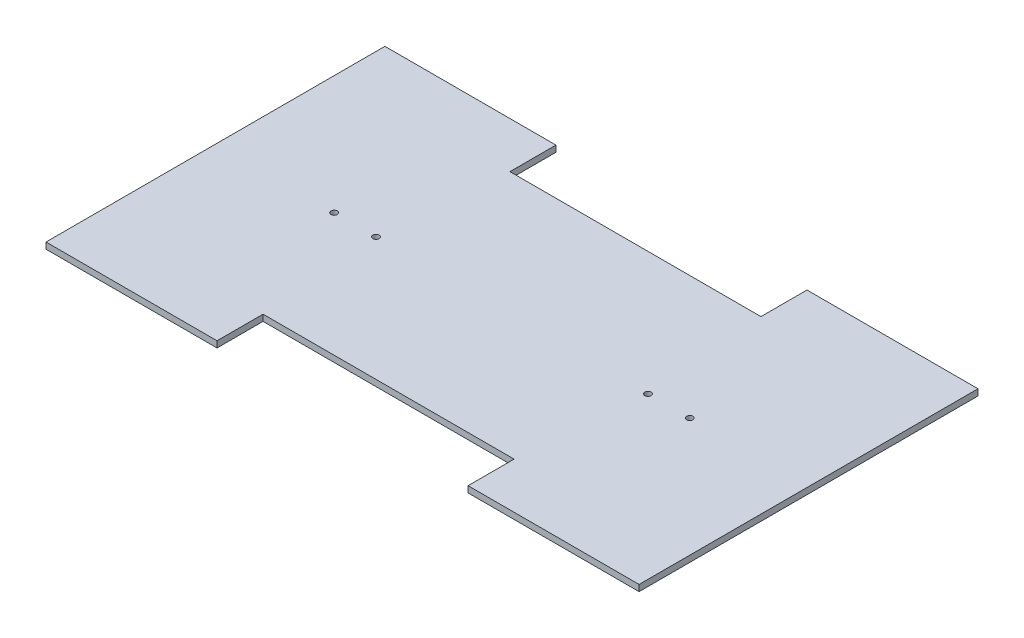
ISO-10303-21;
HEADER;
FILE_DESCRIPTION(('STEP AP214'),'2;1');
FILE_NAME('part.step','',(''),(''),'','','');
FILE_SCHEMA(('AUTOMOTIVE_DESIGN { 1 0 10303 214 1 1 1 1 }'));
ENDSEC;
DATA;
#1=APPLICATION_CONTEXT('core data for automotive mechanical design processes');
#2=APPLICATION_PROTOCOL_DEFINITION('international standard','automotive_design',2000,#1);
#3=PRODUCT_CONTEXT('',#1,'mechanical');
#4=PRODUCT('Part','Part','',(#3));
#5=PRODUCT_RELATED_PRODUCT_CATEGORY('part','',(#4));
#6=PRODUCT_DEFINITION_FORMATION('','',#4);
#7=PRODUCT_DEFINITION_CONTEXT('part definition',#1,'design');
#8=PRODUCT_DEFINITION('design','',#6,#7);
#9=PRODUCT_DEFINITION_SHAPE('','',#8);
#10=(LENGTH_UNIT() NAMED_UNIT(*) SI_UNIT(.MILLI.,.METRE.));
#11=(NAMED_UNIT(*) PLANE_ANGLE_UNIT() SI_UNIT($,.RADIAN.));
#12=(NAMED_UNIT(*) SI_UNIT($,.STERADIAN.) SOLID_ANGLE_UNIT());
#13=UNCERTAINTY_MEASURE_WITH_UNIT(LENGTH_MEASURE(1.E-05),#10,'distance_accuracy_value','');
#14=(GEOMETRIC_REPRESENTATION_CONTEXT(3) GLOBAL_UNCERTAINTY_ASSIGNED_CONTEXT((#13)) GLOBAL_UNIT_ASSIGNED_CONTEXT((#10,
#11,#12)) REPRESENTATION_CONTEXT('',''));
#15=CARTESIAN_POINT('',(0.,0.,0.));
#16=DIRECTION('',(0.,0.,1.));
#17=DIRECTION('',(1.,0.,0.));
#18=AXIS2_PLACEMENT_3D('',#15,#16,#17);
#19=CARTESIAN_POINT('',(-141.75,3.,-81.));
#20=DIRECTION('',(0.,0.,1.));
#21=DIRECTION('',(1.,0.,0.));
#22=AXIS2_PLACEMENT_3D('',#19,#20,#21);
#23=PLANE('',#22);
#24=DIRECTION('',(-1.,0.,0.));
#25=VECTOR('',#24,1.);
#26=CARTESIAN_POINT('',(-141.75,3.,-81.));
#27=LINE('',#26,#25);
#28=CARTESIAN_POINT('',(-60.,3.,-81.));
#29=VERTEX_POINT('',#28);
#30=CARTESIAN_POINT('',(-141.75,3.,-81.));
#31=VERTEX_POINT('',#30);
#32=EDGE_CURVE('E224',#29,#31,#27,.T.);
#33=ORIENTED_EDGE('',*,*,#32,.F.);
#34=DIRECTION('',(0.,1.,0.));
#35=VECTOR('',#34,1.);
#36=CARTESIAN_POINT('',(-60.,0.,-81.));
#37=LINE('',#36,#35);
#38=CARTESIAN_POINT('',(-60.,0.,-81.));
#39=VERTEX_POINT('',#38);
#40=EDGE_CURVE('E164',#39,#29,#37,.T.);
#41=ORIENTED_EDGE('',*,*,#40,.F.);
#42=DIRECTION('',(-1.,0.,0.));
#43=VECTOR('',#42,1.);
#44=CARTESIAN_POINT('',(-141.75,0.,-81.));
#45=LINE('',#44,#43);
#46=CARTESIAN_POINT('',(-141.75,0.,-81.));
#47=VERTEX_POINT('',#46);
#48=EDGE_CURVE('E281',#39,#47,#45,.T.);
#49=ORIENTED_EDGE('',*,*,#48,.T.);
#50=DIRECTION('',(0.,-1.,0.));
#51=VECTOR('',#50,1.);
#52=CARTESIAN_POINT('',(-141.75,3.,-81.));
#53=LINE('',#52,#51);
#54=EDGE_CURVE('E49',#31,#47,#53,.T.);
#55=ORIENTED_EDGE('',*,*,#54,.F.);
#56=EDGE_LOOP('',(#33,#41,#49,#55));
#57=FACE_BOUND('',#56,.T.);
#58=ADVANCED_FACE('F41',(#57),#23,.F.);
#59=CARTESIAN_POINT('',(-141.75,3.,81.));
#60=DIRECTION('',(0.,0.,-1.));
#61=DIRECTION('',(-1.,0.,0.));
#62=AXIS2_PLACEMENT_3D('',#59,#60,#61);
#63=PLANE('',#62);
#64=DIRECTION('',(1.,0.,0.));
#65=VECTOR('',#64,1.);
#66=CARTESIAN_POINT('',(-141.75,3.,81.));
#67=LINE('',#66,#65);
#68=CARTESIAN_POINT('',(60.,3.,81.));
#69=VERTEX_POINT('',#68);
#70=CARTESIAN_POINT('',(141.75,3.,81.));
#71=VERTEX_POINT('',#70);
#72=EDGE_CURVE('E181',#69,#71,#67,.T.);
#73=ORIENTED_EDGE('',*,*,#72,.F.);
#74=DIRECTION('',(0.,1.,0.));
#75=VECTOR('',#74,1.);
#76=CARTESIAN_POINT('',(60.,0.,81.));
#77=LINE('',#76,#75);
#78=CARTESIAN_POINT('',(60.,0.,81.));
#79=VERTEX_POINT('',#78);
#80=EDGE_CURVE('E193',#79,#69,#77,.T.);
#81=ORIENTED_EDGE('',*,*,#80,.F.);
#82=DIRECTION('',(1.,0.,0.));
#83=VECTOR('',#82,1.);
#84=CARTESIAN_POINT('',(-141.75,0.,81.));
#85=LINE('',#84,#83);
#86=CARTESIAN_POINT('',(141.75,0.,81.));
#87=VERTEX_POINT('',#86);
#88=EDGE_CURVE('E150',#79,#87,#85,.T.);
#89=ORIENTED_EDGE('',*,*,#88,.T.);
#90=DIRECTION('',(0.,-1.,0.));
#91=VECTOR('',#90,1.);
#92=CARTESIAN_POINT('',(141.75,3.,81.));
#93=LINE('',#92,#91);
#94=EDGE_CURVE('E180',#71,#87,#93,.T.);
#95=ORIENTED_EDGE('',*,*,#94,.F.);
#96=EDGE_LOOP('',(#73,#81,#89,#95));
#97=FACE_BOUND('',#96,.T.);
#98=ADVANCED_FACE('F294',(#97),#63,.F.);
#99=CARTESIAN_POINT('',(141.75,3.,-81.));
#100=DIRECTION('',(-1.,0.,0.));
#101=DIRECTION('',(0.,0.,1.));
#102=AXIS2_PLACEMENT_3D('',#99,#100,#101);
#103=PLANE('',#102);
#104=DIRECTION('',(0.,0.,-1.));
#105=VECTOR('',#104,1.);
#106=CARTESIAN_POINT('',(141.75,0.,-81.));
#107=LINE('',#106,#105);
#108=CARTESIAN_POINT('',(141.75,0.,-81.));
#109=VERTEX_POINT('',#108);
#110=EDGE_CURVE('E185',#87,#109,#107,.T.);
#111=ORIENTED_EDGE('',*,*,#110,.T.);
#112=DIRECTION('',(0.,-1.,0.));
#113=VECTOR('',#112,1.);
#114=CARTESIAN_POINT('',(141.75,3.,-81.));
#115=LINE('',#114,#113);
#116=CARTESIAN_POINT('',(141.75,3.,-81.));
#117=VERTEX_POINT('',#116);
#118=EDGE_CURVE('E12',#117,#109,#115,.T.);
#119=ORIENTED_EDGE('',*,*,#118,.F.);
#120=DIRECTION('',(0.,0.,-1.));
#121=VECTOR('',#120,1.);
#122=CARTESIAN_POINT('',(141.75,3.,-81.));
#123=LINE('',#122,#121);
#124=EDGE_CURVE('E225',#71,#117,#123,.T.);
#125=ORIENTED_EDGE('',*,*,#124,.F.);
#126=ORIENTED_EDGE('',*,*,#94,.T.);
#127=EDGE_LOOP('',(#111,#119,#125,#126));
#128=FACE_BOUND('',#127,.T.);
#129=ADVANCED_FACE('F43',(#128),#103,.F.);
#130=CARTESIAN_POINT('',(60.,0.,-81.));
#131=VERTEX_POINT('',#130);
#132=EDGE_CURVE('E282',#109,#131,#45,.T.);
#133=ORIENTED_EDGE('',*,*,#132,.T.);
#134=DIRECTION('',(0.,1.,0.));
#135=VECTOR('',#134,1.);
#136=CARTESIAN_POINT('',(60.,0.,-81.));
#137=LINE('',#136,#135);
#138=CARTESIAN_POINT('',(60.,3.,-81.));
#139=VERTEX_POINT('',#138);
#140=EDGE_CURVE('E233',#131,#139,#137,.T.);
#141=ORIENTED_EDGE('',*,*,#140,.T.);
#142=EDGE_CURVE('E220',#117,#139,#27,.T.);
#143=ORIENTED_EDGE('',*,*,#142,.F.);
#144=ORIENTED_EDGE('',*,*,#118,.T.);
#145=EDGE_LOOP('',(#133,#141,#143,#144));
#146=FACE_BOUND('',#145,.T.);
#147=ADVANCED_FACE('F290',(#146),#23,.F.);
#148=CARTESIAN_POINT('',(-141.75,3.,-81.));
#149=DIRECTION('',(1.,0.,0.));
#150=DIRECTION('',(0.,0.,-1.));
#151=AXIS2_PLACEMENT_3D('',#148,#149,#150);
#152=PLANE('',#151);
#153=DIRECTION('',(0.,0.,1.));
#154=VECTOR('',#153,1.);
#155=CARTESIAN_POINT('',(-141.75,0.,-81.));
#156=LINE('',#155,#154);
#157=CARTESIAN_POINT('',(-141.75,0.,81.));
#158=VERTEX_POINT('',#157);
#159=EDGE_CURVE('E269',#47,#158,#156,.T.);
#160=ORIENTED_EDGE('',*,*,#159,.T.);
#161=DIRECTION('',(0.,-1.,0.));
#162=VECTOR('',#161,1.);
#163=CARTESIAN_POINT('',(-141.75,3.,81.));
#164=LINE('',#163,#162);
#165=CARTESIAN_POINT('',(-141.75,3.,81.));
#166=VERTEX_POINT('',#165);
#167=EDGE_CURVE('E264',#166,#158,#164,.T.);
#168=ORIENTED_EDGE('',*,*,#167,.F.);
#169=DIRECTION('',(0.,0.,1.));
#170=VECTOR('',#169,1.);
#171=CARTESIAN_POINT('',(-141.75,3.,-81.));
#172=LINE('',#171,#170);
#173=EDGE_CURVE('E182',#31,#166,#172,.T.);
#174=ORIENTED_EDGE('',*,*,#173,.F.);
#175=ORIENTED_EDGE('',*,*,#54,.T.);
#176=EDGE_LOOP('',(#160,#168,#174,#175));
#177=FACE_BOUND('',#176,.T.);
#178=ADVANCED_FACE('F278',(#177),#152,.F.);
#179=CARTESIAN_POINT('',(-60.,0.,81.));
#180=VERTEX_POINT('',#179);
#181=EDGE_CURVE('E262',#158,#180,#85,.T.);
#182=ORIENTED_EDGE('',*,*,#181,.T.);
#183=DIRECTION('',(0.,1.,0.));
#184=VECTOR('',#183,1.);
#185=CARTESIAN_POINT('',(-60.,0.,81.));
#186=LINE('',#185,#184);
#187=CARTESIAN_POINT('',(-60.,3.,81.));
#188=VERTEX_POINT('',#187);
#189=EDGE_CURVE('E195',#180,#188,#186,.T.);
#190=ORIENTED_EDGE('',*,*,#189,.T.);
#191=EDGE_CURVE('E174',#166,#188,#67,.T.);
#192=ORIENTED_EDGE('',*,*,#191,.F.);
#193=ORIENTED_EDGE('',*,*,#167,.T.);
#194=EDGE_LOOP('',(#182,#190,#192,#193));
#195=FACE_BOUND('',#194,.T.);
#196=ADVANCED_FACE('F259',(#195),#63,.F.);
#197=CARTESIAN_POINT('',(0.,3.,0.));
#198=DIRECTION('',(0.,1.,0.));
#199=DIRECTION('',(0.,0.,1.));
#200=AXIS2_PLACEMENT_3D('',#197,#198,#199);
#201=PLANE('',#200);
#202=CARTESIAN_POINT('',(-85.,3.,0.));
#203=DIRECTION('',(0.,1.,0.));
#204=DIRECTION('',(0.,0.,1.));
#205=AXIS2_PLACEMENT_3D('',#202,#203,#204);
#206=CIRCLE('',#205,1.5);
#207=CARTESIAN_POINT('',(-85.,3.,1.5));
#208=VERTEX_POINT('',#207);
#209=EDGE_CURVE('E447',#208,#208,#206,.T.);
#210=ORIENTED_EDGE('',*,*,#209,.F.);
#211=EDGE_LOOP('',(#210));
#212=FACE_BOUND('',#211,.T.);
#213=CARTESIAN_POINT('',(-65.,3.,0.));
#214=DIRECTION('',(0.,1.,0.));
#215=DIRECTION('',(0.,0.,1.));
#216=AXIS2_PLACEMENT_3D('',#213,#214,#215);
#217=CIRCLE('',#216,1.50000000000001);
#218=CARTESIAN_POINT('',(-65.,3.,1.50000000000002));
#219=VERTEX_POINT('',#218);
#220=EDGE_CURVE('E454',#219,#219,#217,.T.);
#221=ORIENTED_EDGE('',*,*,#220,.F.);
#222=EDGE_LOOP('',(#221));
#223=FACE_BOUND('',#222,.T.);
#224=CARTESIAN_POINT('',(65.,3.,0.));
#225=DIRECTION('',(0.,1.,0.));
#226=DIRECTION('',(0.,0.,1.));
#227=AXIS2_PLACEMENT_3D('',#224,#225,#226);
#228=CIRCLE('',#227,1.50000000000001);
#229=CARTESIAN_POINT('',(65.,3.,1.50000000000001));
#230=VERTEX_POINT('',#229);
#231=EDGE_CURVE('E466',#230,#230,#228,.T.);
#232=ORIENTED_EDGE('',*,*,#231,.F.);
#233=EDGE_LOOP('',(#232));
#234=FACE_BOUND('',#233,.T.);
#235=CARTESIAN_POINT('',(85.,3.,0.));
#236=DIRECTION('',(0.,1.,0.));
#237=DIRECTION('',(0.,0.,1.));
#238=AXIS2_PLACEMENT_3D('',#235,#236,#237);
#239=CIRCLE('',#238,1.5);
#240=CARTESIAN_POINT('',(85.,3.,1.5));
#241=VERTEX_POINT('',#240);
#242=EDGE_CURVE('E157',#241,#241,#239,.T.);
#243=ORIENTED_EDGE('',*,*,#242,.F.);
#244=EDGE_LOOP('',(#243));
#245=FACE_BOUND('',#244,.T.);
#246=DIRECTION('',(0.,0.,-1.));
#247=VECTOR('',#246,1.);
#248=CARTESIAN_POINT('',(60.,3.,81.));
#249=LINE('',#248,#247);
#250=CARTESIAN_POINT('',(60.,3.,59.));
#251=VERTEX_POINT('',#250);
#252=EDGE_CURVE('E136',#69,#251,#249,.T.);
#253=ORIENTED_EDGE('',*,*,#252,.F.);
#254=ORIENTED_EDGE('',*,*,#72,.T.);
#255=ORIENTED_EDGE('',*,*,#124,.T.);
#256=ORIENTED_EDGE('',*,*,#142,.T.);
#257=DIRECTION('',(0.,0.,-1.));
#258=VECTOR('',#257,1.);
#259=CARTESIAN_POINT('',(60.,3.,-81.));
#260=LINE('',#259,#258);
#261=CARTESIAN_POINT('',(60.,3.,-59.));
#262=VERTEX_POINT('',#261);
#263=EDGE_CURVE('E203',#262,#139,#260,.T.);
#264=ORIENTED_EDGE('',*,*,#263,.F.);
#265=DIRECTION('',(1.,0.,0.));
#266=VECTOR('',#265,1.);
#267=CARTESIAN_POINT('',(-60.,3.,-59.));
#268=LINE('',#267,#266);
#269=CARTESIAN_POINT('',(-60.,3.,-59.));
#270=VERTEX_POINT('',#269);
#271=EDGE_CURVE('E213',#270,#262,#268,.T.);
#272=ORIENTED_EDGE('',*,*,#271,.F.);
#273=DIRECTION('',(0.,0.,1.));
#274=VECTOR('',#273,1.);
#275=CARTESIAN_POINT('',(-60.,3.,-81.));
#276=LINE('',#275,#274);
#277=EDGE_CURVE('E208',#29,#270,#276,.T.);
#278=ORIENTED_EDGE('',*,*,#277,.F.);
#279=ORIENTED_EDGE('',*,*,#32,.T.);
#280=ORIENTED_EDGE('',*,*,#173,.T.);
#281=ORIENTED_EDGE('',*,*,#191,.T.);
#282=DIRECTION('',(0.,0.,1.));
#283=VECTOR('',#282,1.);
#284=CARTESIAN_POINT('',(-60.,3.,81.));
#285=LINE('',#284,#283);
#286=CARTESIAN_POINT('',(-60.,3.,59.));
#287=VERTEX_POINT('',#286);
#288=EDGE_CURVE('E151',#287,#188,#285,.T.);
#289=ORIENTED_EDGE('',*,*,#288,.F.);
#290=DIRECTION('',(-1.,0.,0.));
#291=VECTOR('',#290,1.);
#292=CARTESIAN_POINT('',(-60.,3.,59.));
#293=LINE('',#292,#291);
#294=EDGE_CURVE('E154',#251,#287,#293,.T.);
#295=ORIENTED_EDGE('',*,*,#294,.F.);
#296=EDGE_LOOP('',(#253,#254,#255,#256,#264,#272,#278,#279,#280,#281,#289,#295));
#297=FACE_BOUND('',#296,.T.);
#298=ADVANCED_FACE('F249',(#212,#223,#234,#245,#297),#201,.T.);
#299=CARTESIAN_POINT('',(0.,0.,0.));
#300=DIRECTION('',(0.,1.,0.));
#301=DIRECTION('',(0.,0.,1.));
#302=AXIS2_PLACEMENT_3D('',#299,#300,#301);
#303=PLANE('',#302);
#304=CARTESIAN_POINT('',(-85.,0.,0.));
#305=DIRECTION('',(0.,1.,0.));
#306=DIRECTION('',(0.,0.,1.));
#307=AXIS2_PLACEMENT_3D('',#304,#305,#306);
#308=CIRCLE('',#307,1.5);
#309=CARTESIAN_POINT('',(-85.,0.,1.5));
#310=VERTEX_POINT('',#309);
#311=EDGE_CURVE('E214',#310,#310,#308,.T.);
#312=ORIENTED_EDGE('',*,*,#311,.T.);
#313=EDGE_LOOP('',(#312));
#314=FACE_BOUND('',#313,.T.);
#315=CARTESIAN_POINT('',(-65.,0.,0.));
#316=DIRECTION('',(0.,1.,0.));
#317=DIRECTION('',(0.,0.,1.));
#318=AXIS2_PLACEMENT_3D('',#315,#316,#317);
#319=CIRCLE('',#318,1.50000000000001);
#320=CARTESIAN_POINT('',(-65.,0.,1.50000000000002));
#321=VERTEX_POINT('',#320);
#322=EDGE_CURVE('E449',#321,#321,#319,.T.);
#323=ORIENTED_EDGE('',*,*,#322,.T.);
#324=EDGE_LOOP('',(#323));
#325=FACE_BOUND('',#324,.T.);
#326=CARTESIAN_POINT('',(65.,0.,0.));
#327=DIRECTION('',(0.,1.,0.));
#328=DIRECTION('',(0.,0.,1.));
#329=AXIS2_PLACEMENT_3D('',#326,#327,#328);
#330=CIRCLE('',#329,1.50000000000001);
#331=CARTESIAN_POINT('',(65.,0.,1.50000000000001));
#332=VERTEX_POINT('',#331);
#333=EDGE_CURVE('E464',#332,#332,#330,.T.);
#334=ORIENTED_EDGE('',*,*,#333,.T.);
#335=EDGE_LOOP('',(#334));
#336=FACE_BOUND('',#335,.T.);
#337=CARTESIAN_POINT('',(85.,0.,0.));
#338=DIRECTION('',(0.,1.,0.));
#339=DIRECTION('',(0.,0.,1.));
#340=AXIS2_PLACEMENT_3D('',#337,#338,#339);
#341=CIRCLE('',#340,1.5);
#342=CARTESIAN_POINT('',(85.,0.,1.5));
#343=VERTEX_POINT('',#342);
#344=EDGE_CURVE('E470',#343,#343,#341,.T.);
#345=ORIENTED_EDGE('',*,*,#344,.T.);
#346=EDGE_LOOP('',(#345));
#347=FACE_BOUND('',#346,.T.);
#348=ORIENTED_EDGE('',*,*,#88,.F.);
#349=DIRECTION('',(0.,0.,-1.));
#350=VECTOR('',#349,1.);
#351=CARTESIAN_POINT('',(60.,0.,81.));
#352=LINE('',#351,#350);
#353=CARTESIAN_POINT('',(60.,0.,59.));
#354=VERTEX_POINT('',#353);
#355=EDGE_CURVE('E133',#79,#354,#352,.T.);
#356=ORIENTED_EDGE('',*,*,#355,.T.);
#357=DIRECTION('',(-1.,0.,0.));
#358=VECTOR('',#357,1.);
#359=CARTESIAN_POINT('',(-60.,0.,59.));
#360=LINE('',#359,#358);
#361=CARTESIAN_POINT('',(-60.,0.,59.));
#362=VERTEX_POINT('',#361);
#363=EDGE_CURVE('E143',#354,#362,#360,.T.);
#364=ORIENTED_EDGE('',*,*,#363,.T.);
#365=DIRECTION('',(0.,0.,1.));
#366=VECTOR('',#365,1.);
#367=CARTESIAN_POINT('',(-60.,0.,81.));
#368=LINE('',#367,#366);
#369=EDGE_CURVE('E56',#362,#180,#368,.T.);
#370=ORIENTED_EDGE('',*,*,#369,.T.);
#371=ORIENTED_EDGE('',*,*,#181,.F.);
#372=ORIENTED_EDGE('',*,*,#159,.F.);
#373=ORIENTED_EDGE('',*,*,#48,.F.);
#374=DIRECTION('',(0.,0.,1.));
#375=VECTOR('',#374,1.);
#376=CARTESIAN_POINT('',(-60.,0.,-81.));
#377=LINE('',#376,#375);
#378=CARTESIAN_POINT('',(-60.,0.,-59.));
#379=VERTEX_POINT('',#378);
#380=EDGE_CURVE('E199',#39,#379,#377,.T.);
#381=ORIENTED_EDGE('',*,*,#380,.T.);
#382=DIRECTION('',(1.,0.,0.));
#383=VECTOR('',#382,1.);
#384=CARTESIAN_POINT('',(-60.,0.,-59.));
#385=LINE('',#384,#383);
#386=CARTESIAN_POINT('',(60.,0.,-59.));
#387=VERTEX_POINT('',#386);
#388=EDGE_CURVE('E202',#379,#387,#385,.T.);
#389=ORIENTED_EDGE('',*,*,#388,.T.);
#390=DIRECTION('',(0.,0.,-1.));
#391=VECTOR('',#390,1.);
#392=CARTESIAN_POINT('',(60.,0.,-81.));
#393=LINE('',#392,#391);
#394=EDGE_CURVE('E64',#387,#131,#393,.T.);
#395=ORIENTED_EDGE('',*,*,#394,.T.);
#396=ORIENTED_EDGE('',*,*,#132,.F.);
#397=ORIENTED_EDGE('',*,*,#110,.F.);
#398=EDGE_LOOP('',(#348,#356,#364,#370,#371,#372,#373,#381,#389,#395,#396,#397));
#399=FACE_BOUND('',#398,.T.);
#400=ADVANCED_FACE('F148',(#314,#325,#336,#347,#399),#303,.F.);
#401=CARTESIAN_POINT('',(-60.,0.,-81.));
#402=DIRECTION('',(-1.,0.,0.));
#403=DIRECTION('',(0.,0.,1.));
#404=AXIS2_PLACEMENT_3D('',#401,#402,#403);
#405=PLANE('',#404);
#406=ORIENTED_EDGE('',*,*,#277,.T.);
#407=DIRECTION('',(0.,1.,0.));
#408=VECTOR('',#407,1.);
#409=CARTESIAN_POINT('',(-60.,0.,-59.));
#410=LINE('',#409,#408);
#411=EDGE_CURVE('E207',#379,#270,#410,.T.);
#412=ORIENTED_EDGE('',*,*,#411,.F.);
#413=ORIENTED_EDGE('',*,*,#380,.F.);
#414=ORIENTED_EDGE('',*,*,#40,.T.);
#415=EDGE_LOOP('',(#406,#412,#413,#414));
#416=FACE_BOUND('',#415,.T.);
#417=ADVANCED_FACE('F245',(#416),#405,.F.);
#418=CARTESIAN_POINT('',(60.,0.,-81.));
#419=DIRECTION('',(1.,0.,0.));
#420=DIRECTION('',(0.,0.,-1.));
#421=AXIS2_PLACEMENT_3D('',#418,#419,#420);
#422=PLANE('',#421);
#423=ORIENTED_EDGE('',*,*,#263,.T.);
#424=ORIENTED_EDGE('',*,*,#140,.F.);
#425=ORIENTED_EDGE('',*,*,#394,.F.);
#426=DIRECTION('',(0.,1.,0.));
#427=VECTOR('',#426,1.);
#428=CARTESIAN_POINT('',(60.,0.,-59.));
#429=LINE('',#428,#427);
#430=EDGE_CURVE('E236',#387,#262,#429,.T.);
#431=ORIENTED_EDGE('',*,*,#430,.T.);
#432=EDGE_LOOP('',(#423,#424,#425,#431));
#433=FACE_BOUND('',#432,.T.);
#434=ADVANCED_FACE('F360',(#433),#422,.F.);
#435=CARTESIAN_POINT('',(-60.,0.,-59.));
#436=DIRECTION('',(0.,0.,1.));
#437=DIRECTION('',(1.,0.,0.));
#438=AXIS2_PLACEMENT_3D('',#435,#436,#437);
#439=PLANE('',#438);
#440=ORIENTED_EDGE('',*,*,#271,.T.);
#441=ORIENTED_EDGE('',*,*,#430,.F.);
#442=ORIENTED_EDGE('',*,*,#388,.F.);
#443=ORIENTED_EDGE('',*,*,#411,.T.);
#444=EDGE_LOOP('',(#440,#441,#442,#443));
#445=FACE_BOUND('',#444,.T.);
#446=ADVANCED_FACE('F240',(#445),#439,.F.);
#447=CARTESIAN_POINT('',(60.,0.,81.));
#448=DIRECTION('',(1.,0.,0.));
#449=DIRECTION('',(0.,0.,-1.));
#450=AXIS2_PLACEMENT_3D('',#447,#448,#449);
#451=PLANE('',#450);
#452=ORIENTED_EDGE('',*,*,#252,.T.);
#453=DIRECTION('',(0.,1.,0.));
#454=VECTOR('',#453,1.);
#455=CARTESIAN_POINT('',(60.,0.,59.));
#456=LINE('',#455,#454);
#457=EDGE_CURVE('E129',#354,#251,#456,.T.);
#458=ORIENTED_EDGE('',*,*,#457,.F.);
#459=ORIENTED_EDGE('',*,*,#355,.F.);
#460=ORIENTED_EDGE('',*,*,#80,.T.);
#461=EDGE_LOOP('',(#452,#458,#459,#460));
#462=FACE_BOUND('',#461,.T.);
#463=ADVANCED_FACE('F131',(#462),#451,.F.);
#464=CARTESIAN_POINT('',(-60.,0.,81.));
#465=DIRECTION('',(-1.,0.,0.));
#466=DIRECTION('',(0.,0.,1.));
#467=AXIS2_PLACEMENT_3D('',#464,#465,#466);
#468=PLANE('',#467);
#469=ORIENTED_EDGE('',*,*,#288,.T.);
#470=ORIENTED_EDGE('',*,*,#189,.F.);
#471=ORIENTED_EDGE('',*,*,#369,.F.);
#472=DIRECTION('',(0.,1.,0.));
#473=VECTOR('',#472,1.);
#474=CARTESIAN_POINT('',(-60.,0.,59.));
#475=LINE('',#474,#473);
#476=EDGE_CURVE('E140',#362,#287,#475,.T.);
#477=ORIENTED_EDGE('',*,*,#476,.T.);
#478=EDGE_LOOP('',(#469,#470,#471,#477));
#479=FACE_BOUND('',#478,.T.);
#480=ADVANCED_FACE('F256',(#479),#468,.F.);
#481=CARTESIAN_POINT('',(-60.,0.,59.));
#482=DIRECTION('',(0.,0.,-1.));
#483=DIRECTION('',(-1.,0.,0.));
#484=AXIS2_PLACEMENT_3D('',#481,#482,#483);
#485=PLANE('',#484);
#486=ORIENTED_EDGE('',*,*,#294,.T.);
#487=ORIENTED_EDGE('',*,*,#476,.F.);
#488=ORIENTED_EDGE('',*,*,#363,.F.);
#489=ORIENTED_EDGE('',*,*,#457,.T.);
#490=EDGE_LOOP('',(#486,#487,#488,#489));
#491=FACE_BOUND('',#490,.T.);
#492=ADVANCED_FACE('F144',(#491),#485,.F.);
#493=CARTESIAN_POINT('',(85.,0.,0.));
#494=DIRECTION('',(0.,1.,0.));
#495=DIRECTION('',(0.,0.,1.));
#496=AXIS2_PLACEMENT_3D('',#493,#494,#495);
#497=CYLINDRICAL_SURFACE('',#496,1.5);
#498=ORIENTED_EDGE('',*,*,#344,.F.);
#499=EDGE_LOOP('',(#498));
#500=FACE_BOUND('',#499,.T.);
#501=ORIENTED_EDGE('',*,*,#242,.T.);
#502=EDGE_LOOP('',(#501));
#503=FACE_BOUND('',#502,.T.);
#504=ADVANCED_FACE('F399',(#500,#503),#497,.F.);
#505=CARTESIAN_POINT('',(65.,0.,0.));
#506=DIRECTION('',(0.,1.,0.));
#507=DIRECTION('',(0.,0.,1.));
#508=AXIS2_PLACEMENT_3D('',#505,#506,#507);
#509=CYLINDRICAL_SURFACE('',#508,1.50000000000001);
#510=ORIENTED_EDGE('',*,*,#333,.F.);
#511=EDGE_LOOP('',(#510));
#512=FACE_BOUND('',#511,.T.);
#513=ORIENTED_EDGE('',*,*,#231,.T.);
#514=EDGE_LOOP('',(#513));
#515=FACE_BOUND('',#514,.T.);
#516=ADVANCED_FACE('F408',(#512,#515),#509,.F.);
#517=CARTESIAN_POINT('',(-65.,0.,0.));
#518=DIRECTION('',(0.,1.,0.));
#519=DIRECTION('',(0.,0.,1.));
#520=AXIS2_PLACEMENT_3D('',#517,#518,#519);
#521=CYLINDRICAL_SURFACE('',#520,1.50000000000001);
#522=ORIENTED_EDGE('',*,*,#322,.F.);
#523=EDGE_LOOP('',(#522));
#524=FACE_BOUND('',#523,.T.);
#525=ORIENTED_EDGE('',*,*,#220,.T.);
#526=EDGE_LOOP('',(#525));
#527=FACE_BOUND('',#526,.T.);
#528=ADVANCED_FACE('F415',(#524,#527),#521,.F.);
#529=CARTESIAN_POINT('',(-85.,0.,0.));
#530=DIRECTION('',(0.,1.,0.));
#531=DIRECTION('',(0.,0.,1.));
#532=AXIS2_PLACEMENT_3D('',#529,#530,#531);
#533=CYLINDRICAL_SURFACE('',#532,1.5);
#534=ORIENTED_EDGE('',*,*,#311,.F.);
#535=EDGE_LOOP('',(#534));
#536=FACE_BOUND('',#535,.T.);
#537=ORIENTED_EDGE('',*,*,#209,.T.);
#538=EDGE_LOOP('',(#537));
#539=FACE_BOUND('',#538,.T.);
#540=ADVANCED_FACE('F423',(#536,#539),#533,.F.);
#541=CLOSED_SHELL('',(#58,#98,#129,#147,#178,#196,#298,#400,#417,#434,#446,#463,#480,#492,#504,
#516,#528,#540));
#542=MANIFOLD_SOLID_BREP('B2',#541);
#543=ADVANCED_BREP_SHAPE_REPRESENTATION('',(#18,#542),#14);
#544=SHAPE_DEFINITION_REPRESENTATION(#9,#543);
ENDSEC;
END-ISO-10303-21;
